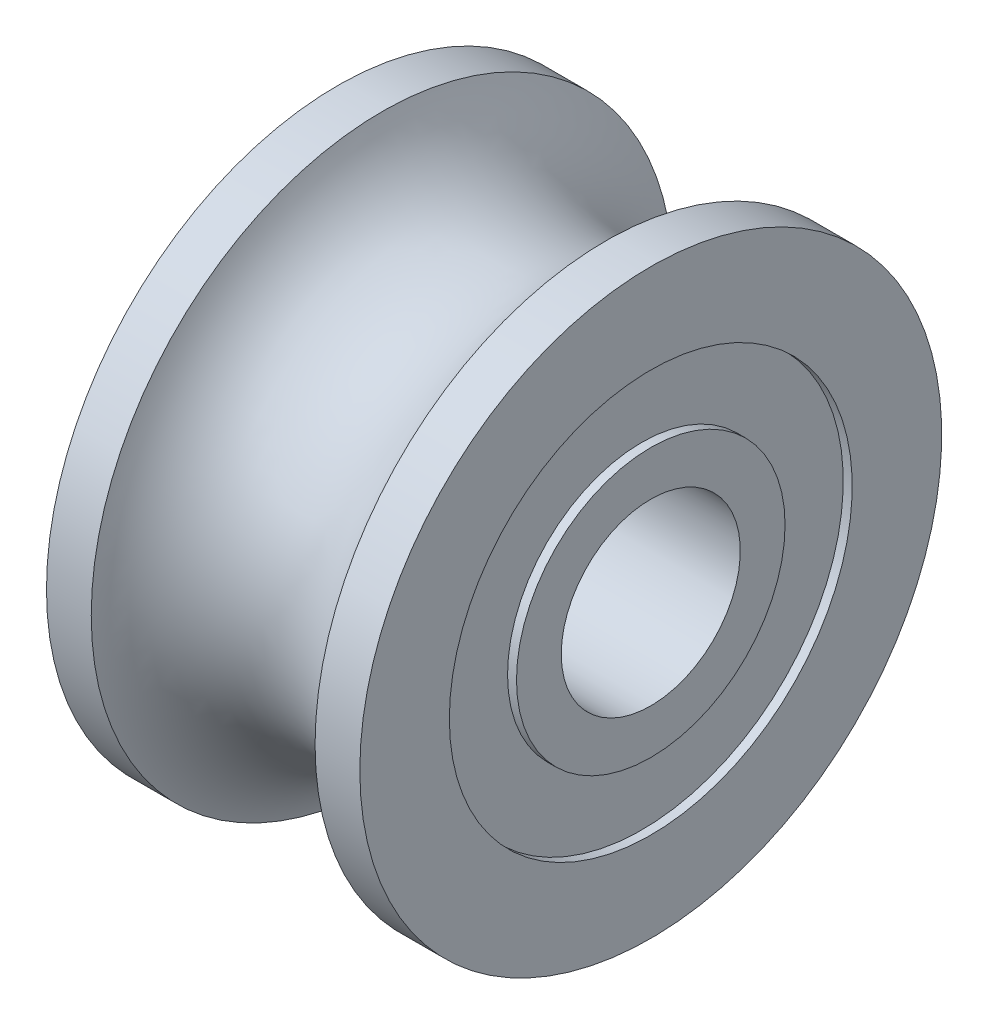
ISO-10303-21;
HEADER;
FILE_DESCRIPTION(('STEP AP214'),'2;1');
FILE_NAME('part.step','',(''),(''),'','','');
FILE_SCHEMA(('AUTOMOTIVE_DESIGN { 1 0 10303 214 1 1 1 1 }'));
ENDSEC;
DATA;
#1=APPLICATION_CONTEXT('core data for automotive mechanical design processes');
#2=APPLICATION_PROTOCOL_DEFINITION('international standard','automotive_design',2000,#1);
#3=PRODUCT_CONTEXT('',#1,'mechanical');
#4=PRODUCT('Part','Part','',(#3));
#5=PRODUCT_RELATED_PRODUCT_CATEGORY('part','',(#4));
#6=PRODUCT_DEFINITION_FORMATION('','',#4);
#7=PRODUCT_DEFINITION_CONTEXT('part definition',#1,'design');
#8=PRODUCT_DEFINITION('design','',#6,#7);
#9=PRODUCT_DEFINITION_SHAPE('','',#8);
#10=(LENGTH_UNIT() NAMED_UNIT(*) SI_UNIT(.MILLI.,.METRE.));
#11=(NAMED_UNIT(*) PLANE_ANGLE_UNIT() SI_UNIT($,.RADIAN.));
#12=(NAMED_UNIT(*) SI_UNIT($,.STERADIAN.) SOLID_ANGLE_UNIT());
#13=UNCERTAINTY_MEASURE_WITH_UNIT(LENGTH_MEASURE(1.E-05),#10,'distance_accuracy_value','');
#14=(GEOMETRIC_REPRESENTATION_CONTEXT(3) GLOBAL_UNCERTAINTY_ASSIGNED_CONTEXT((#13)) GLOBAL_UNIT_ASSIGNED_CONTEXT((#10,
#11,#12)) REPRESENTATION_CONTEXT('',''));
#15=CARTESIAN_POINT('',(0.,0.,0.));
#16=DIRECTION('',(0.,0.,1.));
#17=DIRECTION('',(1.,0.,0.));
#18=AXIS2_PLACEMENT_3D('',#15,#16,#17);
#19=CARTESIAN_POINT('',(-3.5,3.,0.));
#20=DIRECTION('',(1.,0.,0.));
#21=DIRECTION('',(0.,0.,-1.));
#22=AXIS2_PLACEMENT_3D('',#19,#20,#21);
#23=PLANE('',#22);
#24=CARTESIAN_POINT('',(-3.5,0.,0.));
#25=DIRECTION('',(-1.,0.,0.));
#26=DIRECTION('',(0.,0.,1.));
#27=AXIS2_PLACEMENT_3D('',#24,#25,#26);
#28=CIRCLE('',#27,2.);
#29=CARTESIAN_POINT('',(-3.5,0.,2.));
#30=VERTEX_POINT('',#29);
#31=EDGE_CURVE('E10',#30,#30,#28,.T.);
#32=ORIENTED_EDGE('',*,*,#31,.F.);
#33=EDGE_LOOP('',(#32));
#34=FACE_BOUND('',#33,.T.);
#35=CARTESIAN_POINT('',(-3.5,0.,0.));
#36=DIRECTION('',(-1.,0.,0.));
#37=DIRECTION('',(0.,0.,1.));
#38=AXIS2_PLACEMENT_3D('',#35,#36,#37);
#39=CIRCLE('',#38,3.);
#40=CARTESIAN_POINT('',(-3.5,0.,3.));
#41=VERTEX_POINT('',#40);
#42=EDGE_CURVE('E83',#41,#41,#39,.T.);
#43=ORIENTED_EDGE('',*,*,#42,.T.);
#44=EDGE_LOOP('',(#43));
#45=FACE_BOUND('',#44,.T.);
#46=ADVANCED_FACE('F37',(#34,#45),#23,.F.);
#47=CARTESIAN_POINT('',(-3.5,0.,0.));
#48=DIRECTION('',(-1.,0.,0.));
#49=DIRECTION('',(0.,0.,1.));
#50=AXIS2_PLACEMENT_3D('',#47,#48,#49);
#51=CYLINDRICAL_SURFACE('',#50,2.);
#52=CARTESIAN_POINT('',(3.5,0.,0.));
#53=DIRECTION('',(-1.,0.,0.));
#54=DIRECTION('',(0.,0.,1.));
#55=AXIS2_PLACEMENT_3D('',#52,#53,#54);
#56=CIRCLE('',#55,2.);
#57=CARTESIAN_POINT('',(3.5,0.,2.));
#58=VERTEX_POINT('',#57);
#59=EDGE_CURVE('E43',#58,#58,#56,.T.);
#60=ORIENTED_EDGE('',*,*,#59,.F.);
#61=EDGE_LOOP('',(#60));
#62=FACE_BOUND('',#61,.T.);
#63=ORIENTED_EDGE('',*,*,#31,.T.);
#64=EDGE_LOOP('',(#63));
#65=FACE_BOUND('',#64,.T.);
#66=ADVANCED_FACE('F156',(#62,#65),#51,.F.);
#67=CARTESIAN_POINT('',(3.5,3.,0.));
#68=DIRECTION('',(-1.,0.,0.));
#69=DIRECTION('',(0.,0.,1.));
#70=AXIS2_PLACEMENT_3D('',#67,#68,#69);
#71=PLANE('',#70);
#72=CARTESIAN_POINT('',(3.5,0.,0.));
#73=DIRECTION('',(-1.,0.,0.));
#74=DIRECTION('',(0.,0.,1.));
#75=AXIS2_PLACEMENT_3D('',#72,#73,#74);
#76=CIRCLE('',#75,3.);
#77=CARTESIAN_POINT('',(3.5,0.,3.));
#78=VERTEX_POINT('',#77);
#79=EDGE_CURVE('E47',#78,#78,#76,.T.);
#80=ORIENTED_EDGE('',*,*,#79,.F.);
#81=EDGE_LOOP('',(#80));
#82=FACE_BOUND('',#81,.T.);
#83=ORIENTED_EDGE('',*,*,#59,.T.);
#84=EDGE_LOOP('',(#83));
#85=FACE_BOUND('',#84,.T.);
#86=ADVANCED_FACE('F151',(#82,#85),#71,.F.);
#87=CARTESIAN_POINT('',(-3.5,0.,0.));
#88=DIRECTION('',(-1.,0.,0.));
#89=DIRECTION('',(0.,0.,1.));
#90=AXIS2_PLACEMENT_3D('',#87,#88,#89);
#91=CYLINDRICAL_SURFACE('',#90,3.);
#92=CARTESIAN_POINT('',(3.3,0.,0.));
#93=DIRECTION('',(-1.,0.,0.));
#94=DIRECTION('',(0.,0.,1.));
#95=AXIS2_PLACEMENT_3D('',#92,#93,#94);
#96=CIRCLE('',#95,3.);
#97=CARTESIAN_POINT('',(3.3,0.,3.));
#98=VERTEX_POINT('',#97);
#99=EDGE_CURVE('E51',#98,#98,#96,.T.);
#100=ORIENTED_EDGE('',*,*,#99,.F.);
#101=EDGE_LOOP('',(#100));
#102=FACE_BOUND('',#101,.T.);
#103=ORIENTED_EDGE('',*,*,#79,.T.);
#104=EDGE_LOOP('',(#103));
#105=FACE_BOUND('',#104,.T.);
#106=ADVANCED_FACE('F145',(#102,#105),#91,.T.);
#107=CARTESIAN_POINT('',(3.3,4.5,0.));
#108=DIRECTION('',(-1.,0.,0.));
#109=DIRECTION('',(0.,0.,1.));
#110=AXIS2_PLACEMENT_3D('',#107,#108,#109);
#111=PLANE('',#110);
#112=CARTESIAN_POINT('',(3.3,0.,0.));
#113=DIRECTION('',(-1.,0.,0.));
#114=DIRECTION('',(0.,0.,1.));
#115=AXIS2_PLACEMENT_3D('',#112,#113,#114);
#116=CIRCLE('',#115,4.5);
#117=CARTESIAN_POINT('',(3.3,0.,4.5));
#118=VERTEX_POINT('',#117);
#119=EDGE_CURVE('E56',#118,#118,#116,.T.);
#120=ORIENTED_EDGE('',*,*,#119,.F.);
#121=EDGE_LOOP('',(#120));
#122=FACE_BOUND('',#121,.T.);
#123=ORIENTED_EDGE('',*,*,#99,.T.);
#124=EDGE_LOOP('',(#123));
#125=FACE_BOUND('',#124,.T.);
#126=ADVANCED_FACE('F139',(#122,#125),#111,.F.);
#127=CARTESIAN_POINT('',(-3.5,0.,0.));
#128=DIRECTION('',(-1.,0.,0.));
#129=DIRECTION('',(0.,0.,1.));
#130=AXIS2_PLACEMENT_3D('',#127,#128,#129);
#131=CYLINDRICAL_SURFACE('',#130,4.5);
#132=CARTESIAN_POINT('',(3.5,0.,0.));
#133=DIRECTION('',(-1.,0.,0.));
#134=DIRECTION('',(0.,0.,1.));
#135=AXIS2_PLACEMENT_3D('',#132,#133,#134);
#136=CIRCLE('',#135,4.5);
#137=CARTESIAN_POINT('',(3.5,0.,4.5));
#138=VERTEX_POINT('',#137);
#139=EDGE_CURVE('E59',#138,#138,#136,.T.);
#140=ORIENTED_EDGE('',*,*,#139,.F.);
#141=EDGE_LOOP('',(#140));
#142=FACE_BOUND('',#141,.T.);
#143=ORIENTED_EDGE('',*,*,#119,.T.);
#144=EDGE_LOOP('',(#143));
#145=FACE_BOUND('',#144,.T.);
#146=ADVANCED_FACE('F133',(#142,#145),#131,.F.);
#147=CARTESIAN_POINT('',(3.5,6.5,0.));
#148=DIRECTION('',(-1.,0.,0.));
#149=DIRECTION('',(0.,0.,1.));
#150=AXIS2_PLACEMENT_3D('',#147,#148,#149);
#151=PLANE('',#150);
#152=CARTESIAN_POINT('',(3.5,0.,0.));
#153=DIRECTION('',(-1.,0.,0.));
#154=DIRECTION('',(0.,0.,1.));
#155=AXIS2_PLACEMENT_3D('',#152,#153,#154);
#156=CIRCLE('',#155,6.5);
#157=CARTESIAN_POINT('',(3.5,0.,6.5));
#158=VERTEX_POINT('',#157);
#159=EDGE_CURVE('E62',#158,#158,#156,.T.);
#160=ORIENTED_EDGE('',*,*,#159,.F.);
#161=EDGE_LOOP('',(#160));
#162=FACE_BOUND('',#161,.T.);
#163=ORIENTED_EDGE('',*,*,#139,.T.);
#164=EDGE_LOOP('',(#163));
#165=FACE_BOUND('',#164,.T.);
#166=ADVANCED_FACE('F127',(#162,#165),#151,.F.);
#167=CARTESIAN_POINT('',(-3.5,0.,0.));
#168=DIRECTION('',(-1.,0.,0.));
#169=DIRECTION('',(0.,0.,1.));
#170=AXIS2_PLACEMENT_3D('',#167,#168,#169);
#171=CYLINDRICAL_SURFACE('',#170,6.5);
#172=CARTESIAN_POINT('',(2.5,0.,0.));
#173=DIRECTION('',(-1.,0.,0.));
#174=DIRECTION('',(0.,0.,1.));
#175=AXIS2_PLACEMENT_3D('',#172,#173,#174);
#176=CIRCLE('',#175,6.5);
#177=CARTESIAN_POINT('',(2.5,0.,6.5));
#178=VERTEX_POINT('',#177);
#179=EDGE_CURVE('E65',#178,#178,#176,.T.);
#180=ORIENTED_EDGE('',*,*,#179,.F.);
#181=EDGE_LOOP('',(#180));
#182=FACE_BOUND('',#181,.T.);
#183=ORIENTED_EDGE('',*,*,#159,.T.);
#184=EDGE_LOOP('',(#183));
#185=FACE_BOUND('',#184,.T.);
#186=ADVANCED_FACE('F121',(#182,#185),#171,.T.);
#187=CARTESIAN_POINT('',(0.,0.,0.));
#188=DIRECTION('',(-1.,0.,0.));
#189=DIRECTION('',(0.,0.,1.));
#190=AXIS2_PLACEMENT_3D('',#187,#188,#189);
#191=TOROIDAL_SURFACE('',#190,7.41071428571429,2.66071428571429);
#192=CARTESIAN_POINT('',(-2.5,0.,0.));
#193=DIRECTION('',(-1.,0.,0.));
#194=DIRECTION('',(0.,0.,1.));
#195=AXIS2_PLACEMENT_3D('',#192,#193,#194);
#196=CIRCLE('',#195,6.5);
#197=CARTESIAN_POINT('',(-2.5,0.,6.5));
#198=VERTEX_POINT('',#197);
#199=EDGE_CURVE('E68',#198,#198,#196,.T.);
#200=ORIENTED_EDGE('',*,*,#199,.F.);
#201=EDGE_LOOP('',(#200));
#202=FACE_BOUND('',#201,.T.);
#203=ORIENTED_EDGE('',*,*,#179,.T.);
#204=EDGE_LOOP('',(#203));
#205=FACE_BOUND('',#204,.T.);
#206=ADVANCED_FACE('F115',(#202,#205),#191,.F.);
#207=CARTESIAN_POINT('',(-3.5,0.,0.));
#208=DIRECTION('',(-1.,0.,0.));
#209=DIRECTION('',(0.,0.,1.));
#210=AXIS2_PLACEMENT_3D('',#207,#208,#209);
#211=CYLINDRICAL_SURFACE('',#210,6.5);
#212=CARTESIAN_POINT('',(-3.5,0.,0.));
#213=DIRECTION('',(-1.,0.,0.));
#214=DIRECTION('',(0.,0.,1.));
#215=AXIS2_PLACEMENT_3D('',#212,#213,#214);
#216=CIRCLE('',#215,6.5);
#217=CARTESIAN_POINT('',(-3.5,0.,6.5));
#218=VERTEX_POINT('',#217);
#219=EDGE_CURVE('E71',#218,#218,#216,.T.);
#220=ORIENTED_EDGE('',*,*,#219,.F.);
#221=EDGE_LOOP('',(#220));
#222=FACE_BOUND('',#221,.T.);
#223=ORIENTED_EDGE('',*,*,#199,.T.);
#224=EDGE_LOOP('',(#223));
#225=FACE_BOUND('',#224,.T.);
#226=ADVANCED_FACE('F109',(#222,#225),#211,.T.);
#227=CARTESIAN_POINT('',(-3.5,6.5,0.));
#228=DIRECTION('',(1.,0.,0.));
#229=DIRECTION('',(0.,0.,-1.));
#230=AXIS2_PLACEMENT_3D('',#227,#228,#229);
#231=PLANE('',#230);
#232=CARTESIAN_POINT('',(-3.5,0.,0.));
#233=DIRECTION('',(-1.,0.,0.));
#234=DIRECTION('',(0.,0.,1.));
#235=AXIS2_PLACEMENT_3D('',#232,#233,#234);
#236=CIRCLE('',#235,4.5);
#237=CARTESIAN_POINT('',(-3.5,0.,4.5));
#238=VERTEX_POINT('',#237);
#239=EDGE_CURVE('E74',#238,#238,#236,.T.);
#240=ORIENTED_EDGE('',*,*,#239,.F.);
#241=EDGE_LOOP('',(#240));
#242=FACE_BOUND('',#241,.T.);
#243=ORIENTED_EDGE('',*,*,#219,.T.);
#244=EDGE_LOOP('',(#243));
#245=FACE_BOUND('',#244,.T.);
#246=ADVANCED_FACE('F103',(#242,#245),#231,.F.);
#247=CARTESIAN_POINT('',(-3.5,0.,0.));
#248=DIRECTION('',(-1.,0.,0.));
#249=DIRECTION('',(0.,0.,1.));
#250=AXIS2_PLACEMENT_3D('',#247,#248,#249);
#251=CYLINDRICAL_SURFACE('',#250,4.5);
#252=CARTESIAN_POINT('',(-3.3,0.,0.));
#253=DIRECTION('',(-1.,0.,0.));
#254=DIRECTION('',(0.,0.,1.));
#255=AXIS2_PLACEMENT_3D('',#252,#253,#254);
#256=CIRCLE('',#255,4.5);
#257=CARTESIAN_POINT('',(-3.3,0.,4.5));
#258=VERTEX_POINT('',#257);
#259=EDGE_CURVE('E77',#258,#258,#256,.T.);
#260=ORIENTED_EDGE('',*,*,#259,.F.);
#261=EDGE_LOOP('',(#260));
#262=FACE_BOUND('',#261,.T.);
#263=ORIENTED_EDGE('',*,*,#239,.T.);
#264=EDGE_LOOP('',(#263));
#265=FACE_BOUND('',#264,.T.);
#266=ADVANCED_FACE('F97',(#262,#265),#251,.F.);
#267=CARTESIAN_POINT('',(-3.3,4.5,0.));
#268=DIRECTION('',(1.,0.,0.));
#269=DIRECTION('',(0.,0.,-1.));
#270=AXIS2_PLACEMENT_3D('',#267,#268,#269);
#271=PLANE('',#270);
#272=CARTESIAN_POINT('',(-3.3,0.,0.));
#273=DIRECTION('',(-1.,0.,0.));
#274=DIRECTION('',(0.,0.,1.));
#275=AXIS2_PLACEMENT_3D('',#272,#273,#274);
#276=CIRCLE('',#275,3.);
#277=CARTESIAN_POINT('',(-3.3,0.,3.));
#278=VERTEX_POINT('',#277);
#279=EDGE_CURVE('E80',#278,#278,#276,.T.);
#280=ORIENTED_EDGE('',*,*,#279,.F.);
#281=EDGE_LOOP('',(#280));
#282=FACE_BOUND('',#281,.T.);
#283=ORIENTED_EDGE('',*,*,#259,.T.);
#284=EDGE_LOOP('',(#283));
#285=FACE_BOUND('',#284,.T.);
#286=ADVANCED_FACE('F91',(#282,#285),#271,.F.);
#287=CARTESIAN_POINT('',(-3.5,0.,0.));
#288=DIRECTION('',(-1.,0.,0.));
#289=DIRECTION('',(0.,0.,1.));
#290=AXIS2_PLACEMENT_3D('',#287,#288,#289);
#291=CYLINDRICAL_SURFACE('',#290,3.);
#292=ORIENTED_EDGE('',*,*,#42,.F.);
#293=EDGE_LOOP('',(#292));
#294=FACE_BOUND('',#293,.T.);
#295=ORIENTED_EDGE('',*,*,#279,.T.);
#296=EDGE_LOOP('',(#295));
#297=FACE_BOUND('',#296,.T.);
#298=ADVANCED_FACE('F88',(#294,#297),#291,.T.);
#299=CLOSED_SHELL('',(#46,#66,#86,#106,#126,#146,#166,#186,#206,#226,#246,#266,#286,#298));
#300=MANIFOLD_SOLID_BREP('B2',#299);
#301=ADVANCED_BREP_SHAPE_REPRESENTATION('',(#18,#300),#14);
#302=SHAPE_DEFINITION_REPRESENTATION(#9,#301);
ENDSEC;
END-ISO-10303-21;
